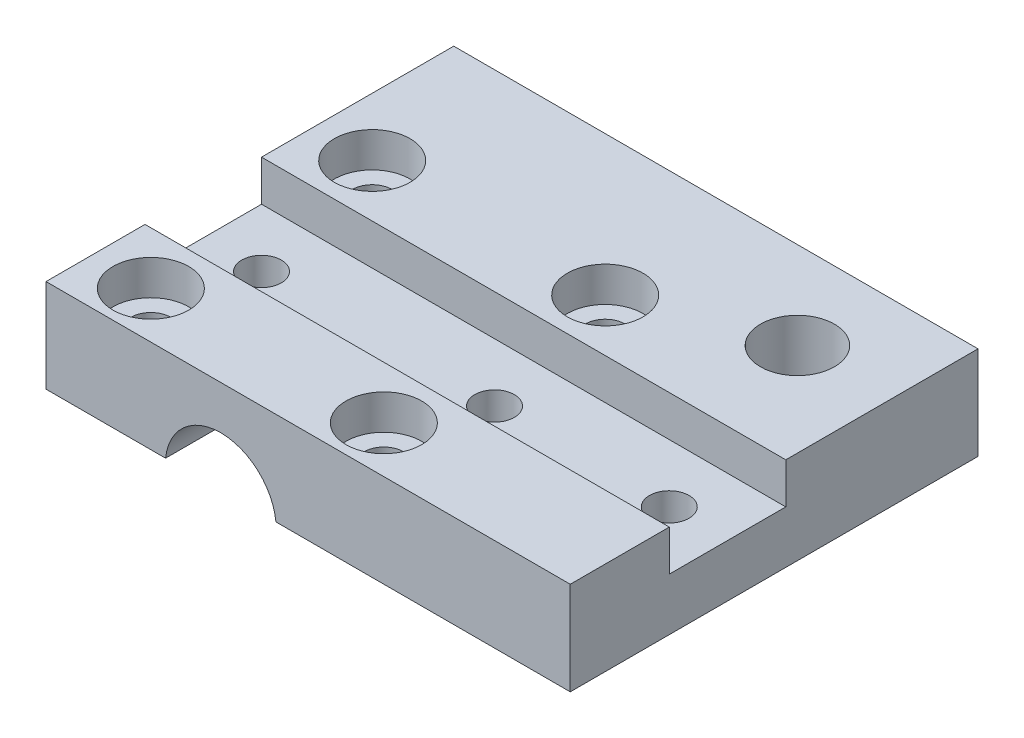
ISO-10303-21;
HEADER;
FILE_DESCRIPTION(('STEP AP214'),'2;1');
FILE_NAME('part.step','',(''),(''),'','','');
FILE_SCHEMA(('AUTOMOTIVE_DESIGN { 1 0 10303 214 1 1 1 1 }'));
ENDSEC;
DATA;
#1=APPLICATION_CONTEXT('core data for automotive mechanical design processes');
#2=APPLICATION_PROTOCOL_DEFINITION('international standard','automotive_design',2000,#1);
#3=PRODUCT_CONTEXT('',#1,'mechanical');
#4=PRODUCT('Part','Part','',(#3));
#5=PRODUCT_RELATED_PRODUCT_CATEGORY('part','',(#4));
#6=PRODUCT_DEFINITION_FORMATION('','',#4);
#7=PRODUCT_DEFINITION_CONTEXT('part definition',#1,'design');
#8=PRODUCT_DEFINITION('design','',#6,#7);
#9=PRODUCT_DEFINITION_SHAPE('','',#8);
#10=(LENGTH_UNIT() NAMED_UNIT(*) SI_UNIT(.MILLI.,.METRE.));
#11=(NAMED_UNIT(*) PLANE_ANGLE_UNIT() SI_UNIT($,.RADIAN.));
#12=(NAMED_UNIT(*) SI_UNIT($,.STERADIAN.) SOLID_ANGLE_UNIT());
#13=UNCERTAINTY_MEASURE_WITH_UNIT(LENGTH_MEASURE(1.E-05),#10,'distance_accuracy_value','');
#14=(GEOMETRIC_REPRESENTATION_CONTEXT(3) GLOBAL_UNCERTAINTY_ASSIGNED_CONTEXT((#13)) GLOBAL_UNIT_ASSIGNED_CONTEXT((#10,
#11,#12)) REPRESENTATION_CONTEXT('',''));
#15=CARTESIAN_POINT('',(0.,0.,0.));
#16=DIRECTION('',(0.,0.,1.));
#17=DIRECTION('',(1.,0.,0.));
#18=AXIS2_PLACEMENT_3D('',#15,#16,#17);
#19=CARTESIAN_POINT('',(25.,5.,3.99999999999999));
#20=DIRECTION('',(0.,1.,0.));
#21=DIRECTION('',(0.,0.,1.));
#22=AXIS2_PLACEMENT_3D('',#19,#20,#21);
#23=CYLINDRICAL_SURFACE('',#22,1.69999999999999);
#24=CARTESIAN_POINT('',(25.,5.,3.99999999999999));
#25=DIRECTION('',(0.,1.,0.));
#26=DIRECTION('',(0.,0.,1.));
#27=AXIS2_PLACEMENT_3D('',#24,#25,#26);
#28=CIRCLE('',#27,1.69999999999999);
#29=CARTESIAN_POINT('',(25.,5.,5.69999999999998));
#30=VERTEX_POINT('',#29);
#31=EDGE_CURVE('E183',#30,#30,#28,.T.);
#32=ORIENTED_EDGE('',*,*,#31,.T.);
#33=EDGE_LOOP('',(#32));
#34=FACE_BOUND('',#33,.T.);
#35=CARTESIAN_POINT('',(25.,1.5,3.99999999999999));
#36=DIRECTION('',(0.,-1.,0.));
#37=DIRECTION('',(0.,0.,-1.));
#38=AXIS2_PLACEMENT_3D('',#35,#36,#37);
#39=CIRCLE('',#38,1.69999999999999);
#40=CARTESIAN_POINT('',(25.,1.5,2.3));
#41=VERTEX_POINT('',#40);
#42=EDGE_CURVE('E36',#41,#41,#39,.F.);
#43=ORIENTED_EDGE('',*,*,#42,.F.);
#44=EDGE_LOOP('',(#43));
#45=FACE_BOUND('',#44,.T.);
#46=ADVANCED_FACE('F32',(#34,#45),#23,.F.);
#47=CARTESIAN_POINT('',(10.,5.,4.));
#48=DIRECTION('',(0.,1.,0.));
#49=DIRECTION('',(0.,0.,1.));
#50=AXIS2_PLACEMENT_3D('',#47,#48,#49);
#51=CYLINDRICAL_SURFACE('',#50,1.69999999999999);
#52=CARTESIAN_POINT('',(10.,5.,4.));
#53=DIRECTION('',(0.,1.,0.));
#54=DIRECTION('',(0.,0.,1.));
#55=AXIS2_PLACEMENT_3D('',#52,#53,#54);
#56=CIRCLE('',#55,1.69999999999999);
#57=CARTESIAN_POINT('',(10.,5.,5.69999999999998));
#58=VERTEX_POINT('',#57);
#59=EDGE_CURVE('E158',#58,#58,#56,.T.);
#60=ORIENTED_EDGE('',*,*,#59,.T.);
#61=EDGE_LOOP('',(#60));
#62=FACE_BOUND('',#61,.T.);
#63=CARTESIAN_POINT('',(10.,1.5,4.));
#64=DIRECTION('',(0.,-1.,0.));
#65=DIRECTION('',(0.,0.,-1.));
#66=AXIS2_PLACEMENT_3D('',#63,#64,#65);
#67=CIRCLE('',#66,1.69999999999999);
#68=CARTESIAN_POINT('',(10.,1.5,2.3));
#69=VERTEX_POINT('',#68);
#70=EDGE_CURVE('E160',#69,#69,#67,.F.);
#71=ORIENTED_EDGE('',*,*,#70,.F.);
#72=EDGE_LOOP('',(#71));
#73=FACE_BOUND('',#72,.T.);
#74=ADVANCED_FACE('F319',(#62,#73),#51,.F.);
#75=CARTESIAN_POINT('',(-10.,5.,3.99999999999999));
#76=DIRECTION('',(0.,1.,0.));
#77=DIRECTION('',(0.,0.,1.));
#78=AXIS2_PLACEMENT_3D('',#75,#76,#77);
#79=CYLINDRICAL_SURFACE('',#78,1.69999999999999);
#80=CARTESIAN_POINT('',(-10.,5.,3.99999999999999));
#81=DIRECTION('',(0.,1.,0.));
#82=DIRECTION('',(0.,0.,1.));
#83=AXIS2_PLACEMENT_3D('',#80,#81,#82);
#84=CIRCLE('',#83,1.69999999999999);
#85=CARTESIAN_POINT('',(-10.,5.,5.69999999999998));
#86=VERTEX_POINT('',#85);
#87=EDGE_CURVE('E186',#86,#86,#84,.T.);
#88=ORIENTED_EDGE('',*,*,#87,.T.);
#89=EDGE_LOOP('',(#88));
#90=FACE_BOUND('',#89,.T.);
#91=CARTESIAN_POINT('',(-10.,1.5,3.99999999999999));
#92=DIRECTION('',(0.,-1.,0.));
#93=DIRECTION('',(0.,0.,-1.));
#94=AXIS2_PLACEMENT_3D('',#91,#92,#93);
#95=CIRCLE('',#94,1.69999999999999);
#96=CARTESIAN_POINT('',(-10.,1.5,2.3));
#97=VERTEX_POINT('',#96);
#98=EDGE_CURVE('E156',#97,#97,#95,.F.);
#99=ORIENTED_EDGE('',*,*,#98,.F.);
#100=EDGE_LOOP('',(#99));
#101=FACE_BOUND('',#100,.T.);
#102=ADVANCED_FACE('F316',(#90,#101),#79,.F.);
#103=CARTESIAN_POINT('',(-15.,8.5,17.5));
#104=DIRECTION('',(0.,-1.,0.));
#105=DIRECTION('',(0.,0.,-1.));
#106=AXIS2_PLACEMENT_3D('',#103,#104,#105);
#107=PLANE('',#106);
#108=CARTESIAN_POINT('',(10.,8.5,-5.50000000000001));
#109=DIRECTION('',(0.,1.,0.));
#110=DIRECTION('',(0.,0.,1.));
#111=AXIS2_PLACEMENT_3D('',#108,#109,#110);
#112=CIRCLE('',#111,3.25);
#113=CARTESIAN_POINT('',(10.,8.5,-2.25000000000001));
#114=VERTEX_POINT('',#113);
#115=EDGE_CURVE('E201',#114,#114,#112,.T.);
#116=ORIENTED_EDGE('',*,*,#115,.F.);
#117=EDGE_LOOP('',(#116));
#118=FACE_BOUND('',#117,.T.);
#119=CARTESIAN_POINT('',(-10.,8.5,-5.5));
#120=DIRECTION('',(0.,1.,0.));
#121=DIRECTION('',(0.,0.,1.));
#122=AXIS2_PLACEMENT_3D('',#119,#120,#121);
#123=CIRCLE('',#122,3.25);
#124=CARTESIAN_POINT('',(-10.,8.5,-2.25000000000001));
#125=VERTEX_POINT('',#124);
#126=EDGE_CURVE('E213',#125,#125,#123,.T.);
#127=ORIENTED_EDGE('',*,*,#126,.F.);
#128=EDGE_LOOP('',(#127));
#129=FACE_BOUND('',#128,.T.);
#130=CARTESIAN_POINT('',(22.,8.5,-10.));
#131=DIRECTION('',(0.,1.,0.));
#132=DIRECTION('',(0.,0.,1.));
#133=AXIS2_PLACEMENT_3D('',#130,#131,#132);
#134=CIRCLE('',#133,3.175);
#135=CARTESIAN_POINT('',(22.,8.5,-6.825));
#136=VERTEX_POINT('',#135);
#137=EDGE_CURVE('E256',#136,#136,#134,.T.);
#138=ORIENTED_EDGE('',*,*,#137,.F.);
#139=EDGE_LOOP('',(#138));
#140=FACE_BOUND('',#139,.T.);
#141=DIRECTION('',(1.,0.,0.));
#142=VECTOR('',#141,1.);
#143=CARTESIAN_POINT('',(-15.,8.5,-1.00000000000001));
#144=LINE('',#143,#142);
#145=CARTESIAN_POINT('',(-15.,8.5,-1.00000000000001));
#146=VERTEX_POINT('',#145);
#147=CARTESIAN_POINT('',(30.,8.5,-1.));
#148=VERTEX_POINT('',#147);
#149=EDGE_CURVE('E242',#146,#148,#144,.T.);
#150=ORIENTED_EDGE('',*,*,#149,.T.);
#151=DIRECTION('',(0.,0.,-1.));
#152=VECTOR('',#151,1.);
#153=CARTESIAN_POINT('',(30.,8.5,17.5));
#154=LINE('',#153,#152);
#155=CARTESIAN_POINT('',(30.,8.5,-17.5));
#156=VERTEX_POINT('',#155);
#157=EDGE_CURVE('E151',#148,#156,#154,.T.);
#158=ORIENTED_EDGE('',*,*,#157,.T.);
#159=DIRECTION('',(-1.,0.,0.));
#160=VECTOR('',#159,1.);
#161=CARTESIAN_POINT('',(-15.,8.5,-17.5));
#162=LINE('',#161,#160);
#163=CARTESIAN_POINT('',(-15.,8.5,-17.5));
#164=VERTEX_POINT('',#163);
#165=EDGE_CURVE('E145',#156,#164,#162,.T.);
#166=ORIENTED_EDGE('',*,*,#165,.T.);
#167=DIRECTION('',(0.,0.,-1.));
#168=VECTOR('',#167,1.);
#169=CARTESIAN_POINT('',(-15.,8.5,17.5));
#170=LINE('',#169,#168);
#171=EDGE_CURVE('E86',#146,#164,#170,.T.);
#172=ORIENTED_EDGE('',*,*,#171,.F.);
#173=EDGE_LOOP('',(#150,#158,#166,#172));
#174=FACE_BOUND('',#173,.T.);
#175=ADVANCED_FACE('F279',(#118,#129,#140,#174),#107,.F.);
#176=CARTESIAN_POINT('',(-15.,0.5,17.5));
#177=DIRECTION('',(1.,0.,0.));
#178=DIRECTION('',(0.,0.,-1.));
#179=AXIS2_PLACEMENT_3D('',#176,#177,#178);
#180=PLANE('',#179);
#181=CARTESIAN_POINT('',(-15.,8.5,17.5));
#182=VERTEX_POINT('',#181);
#183=CARTESIAN_POINT('',(-15.,8.5,8.99999999999999));
#184=VERTEX_POINT('',#183);
#185=EDGE_CURVE('E148',#182,#184,#170,.T.);
#186=ORIENTED_EDGE('',*,*,#185,.T.);
#187=DIRECTION('',(0.,1.,0.));
#188=VECTOR('',#187,1.);
#189=CARTESIAN_POINT('',(-15.,5.,8.99999999999999));
#190=LINE('',#189,#188);
#191=CARTESIAN_POINT('',(-15.,5.,8.99999999999999));
#192=VERTEX_POINT('',#191);
#193=EDGE_CURVE('E253',#192,#184,#190,.T.);
#194=ORIENTED_EDGE('',*,*,#193,.F.);
#195=DIRECTION('',(0.,0.,-1.));
#196=VECTOR('',#195,1.);
#197=CARTESIAN_POINT('',(-15.,5.,8.99999999999999));
#198=LINE('',#197,#196);
#199=CARTESIAN_POINT('',(-15.,5.,-1.00000000000001));
#200=VERTEX_POINT('',#199);
#201=EDGE_CURVE('E246',#192,#200,#198,.T.);
#202=ORIENTED_EDGE('',*,*,#201,.T.);
#203=DIRECTION('',(0.,1.,0.));
#204=VECTOR('',#203,1.);
#205=CARTESIAN_POINT('',(-15.,5.,-1.00000000000001));
#206=LINE('',#205,#204);
#207=EDGE_CURVE('E257',#200,#146,#206,.T.);
#208=ORIENTED_EDGE('',*,*,#207,.T.);
#209=ORIENTED_EDGE('',*,*,#171,.T.);
#210=DIRECTION('',(0.,-1.,0.));
#211=VECTOR('',#210,1.);
#212=CARTESIAN_POINT('',(-15.,0.5,-17.5));
#213=LINE('',#212,#211);
#214=CARTESIAN_POINT('',(-15.,0.5,-17.5));
#215=VERTEX_POINT('',#214);
#216=EDGE_CURVE('E135',#164,#215,#213,.T.);
#217=ORIENTED_EDGE('',*,*,#216,.T.);
#218=DIRECTION('',(0.,0.,-1.));
#219=VECTOR('',#218,1.);
#220=CARTESIAN_POINT('',(-15.,0.5,17.5));
#221=LINE('',#220,#219);
#222=CARTESIAN_POINT('',(-15.,0.5,17.5));
#223=VERTEX_POINT('',#222);
#224=EDGE_CURVE('E11',#223,#215,#221,.T.);
#225=ORIENTED_EDGE('',*,*,#224,.F.);
#226=DIRECTION('',(0.,-1.,0.));
#227=VECTOR('',#226,1.);
#228=CARTESIAN_POINT('',(-15.,0.5,17.5));
#229=LINE('',#228,#227);
#230=EDGE_CURVE('E147',#182,#223,#229,.T.);
#231=ORIENTED_EDGE('',*,*,#230,.F.);
#232=EDGE_LOOP('',(#186,#194,#202,#208,#209,#217,#225,#231));
#233=FACE_BOUND('',#232,.T.);
#234=ADVANCED_FACE('F34',(#233),#180,.F.);
#235=CARTESIAN_POINT('',(-15.,0.5,17.5));
#236=DIRECTION('',(0.,1.,0.));
#237=DIRECTION('',(0.,0.,1.));
#238=AXIS2_PLACEMENT_3D('',#235,#236,#237);
#239=PLANE('',#238);
#240=CARTESIAN_POINT('',(-10.,0.5,3.99999999999999));
#241=DIRECTION('',(0.,-1.,0.));
#242=DIRECTION('',(0.,0.,-1.));
#243=AXIS2_PLACEMENT_3D('',#240,#241,#242);
#244=CIRCLE('',#243,4.);
#245=CARTESIAN_POINT('',(-10.,0.5,0.));
#246=VERTEX_POINT('',#245);
#247=EDGE_CURVE('E162',#246,#246,#244,.T.);
#248=ORIENTED_EDGE('',*,*,#247,.F.);
#249=EDGE_LOOP('',(#248));
#250=FACE_BOUND('',#249,.T.);
#251=CARTESIAN_POINT('',(-10.,0.5,-5.5));
#252=DIRECTION('',(0.,1.,0.));
#253=DIRECTION('',(0.,0.,1.));
#254=AXIS2_PLACEMENT_3D('',#251,#252,#253);
#255=CIRCLE('',#254,1.7);
#256=CARTESIAN_POINT('',(-10.,0.5,-3.8));
#257=VERTEX_POINT('',#256);
#258=EDGE_CURVE('E222',#257,#257,#255,.T.);
#259=ORIENTED_EDGE('',*,*,#258,.T.);
#260=EDGE_LOOP('',(#259));
#261=FACE_BOUND('',#260,.T.);
#262=CARTESIAN_POINT('',(-10.,0.5,13.5));
#263=DIRECTION('',(0.,1.,0.));
#264=DIRECTION('',(0.,0.,1.));
#265=AXIS2_PLACEMENT_3D('',#262,#263,#264);
#266=CIRCLE('',#265,1.7);
#267=CARTESIAN_POINT('',(-10.,0.5,15.2));
#268=VERTEX_POINT('',#267);
#269=EDGE_CURVE('E234',#268,#268,#266,.T.);
#270=ORIENTED_EDGE('',*,*,#269,.T.);
#271=EDGE_LOOP('',(#270));
#272=FACE_BOUND('',#271,.T.);
#273=DIRECTION('',(1.,0.,0.));
#274=VECTOR('',#273,1.);
#275=CARTESIAN_POINT('',(-15.,0.5,-17.5));
#276=LINE('',#275,#274);
#277=CARTESIAN_POINT('',(-4.73618055504644,0.5,-17.5));
#278=VERTEX_POINT('',#277);
#279=EDGE_CURVE('E137',#215,#278,#276,.T.);
#280=ORIENTED_EDGE('',*,*,#279,.T.);
#281=DIRECTION('',(0.,0.,-1.));
#282=VECTOR('',#281,1.);
#283=CARTESIAN_POINT('',(-4.73618055504644,0.5,17.5));
#284=LINE('',#283,#282);
#285=CARTESIAN_POINT('',(-4.73618055504644,0.5,17.5));
#286=VERTEX_POINT('',#285);
#287=EDGE_CURVE('E41',#286,#278,#284,.T.);
#288=ORIENTED_EDGE('',*,*,#287,.F.);
#289=DIRECTION('',(1.,0.,0.));
#290=VECTOR('',#289,1.);
#291=CARTESIAN_POINT('',(-15.,0.5,17.5));
#292=LINE('',#291,#290);
#293=EDGE_CURVE('E94',#223,#286,#292,.T.);
#294=ORIENTED_EDGE('',*,*,#293,.F.);
#295=ORIENTED_EDGE('',*,*,#224,.T.);
#296=EDGE_LOOP('',(#280,#288,#294,#295));
#297=FACE_BOUND('',#296,.T.);
#298=ADVANCED_FACE('F268',(#250,#261,#272,#297),#239,.F.);
#299=CARTESIAN_POINT('',(0.,0.,17.5));
#300=DIRECTION('',(0.,0.,-1.));
#301=DIRECTION('',(-1.,0.,0.));
#302=AXIS2_PLACEMENT_3D('',#299,#300,#301);
#303=CYLINDRICAL_SURFACE('',#302,4.7625);
#304=CARTESIAN_POINT('',(0.,0.,-17.5));
#305=DIRECTION('',(0.,0.,-1.));
#306=DIRECTION('',(1.,0.,0.));
#307=AXIS2_PLACEMENT_3D('',#304,#305,#306);
#308=CIRCLE('',#307,4.7625);
#309=CARTESIAN_POINT('',(4.73618055504644,0.5,-17.5));
#310=VERTEX_POINT('',#309);
#311=EDGE_CURVE('E140',#278,#310,#308,.T.);
#312=ORIENTED_EDGE('',*,*,#311,.T.);
#313=DIRECTION('',(0.,0.,-1.));
#314=VECTOR('',#313,1.);
#315=CARTESIAN_POINT('',(4.73618055504644,0.5,17.5));
#316=LINE('',#315,#314);
#317=CARTESIAN_POINT('',(4.73618055504644,0.5,17.5));
#318=VERTEX_POINT('',#317);
#319=EDGE_CURVE('E124',#318,#310,#316,.T.);
#320=ORIENTED_EDGE('',*,*,#319,.F.);
#321=CARTESIAN_POINT('',(0.,0.,17.5));
#322=DIRECTION('',(0.,0.,-1.));
#323=DIRECTION('',(1.,0.,0.));
#324=AXIS2_PLACEMENT_3D('',#321,#322,#323);
#325=CIRCLE('',#324,4.7625);
#326=EDGE_CURVE('E111',#286,#318,#325,.T.);
#327=ORIENTED_EDGE('',*,*,#326,.F.);
#328=ORIENTED_EDGE('',*,*,#287,.T.);
#329=EDGE_LOOP('',(#312,#320,#327,#328));
#330=FACE_BOUND('',#329,.T.);
#331=ADVANCED_FACE('F271',(#330),#303,.F.);
#332=CARTESIAN_POINT('',(4.73618055504644,0.5,17.5));
#333=DIRECTION('',(0.,1.,0.));
#334=DIRECTION('',(0.,0.,1.));
#335=AXIS2_PLACEMENT_3D('',#332,#333,#334);
#336=PLANE('',#335);
#337=CARTESIAN_POINT('',(25.,0.5,3.99999999999999));
#338=DIRECTION('',(0.,-1.,0.));
#339=DIRECTION('',(0.,0.,-1.));
#340=AXIS2_PLACEMENT_3D('',#337,#338,#339);
#341=CIRCLE('',#340,4.);
#342=CARTESIAN_POINT('',(25.,0.5,0.));
#343=VERTEX_POINT('',#342);
#344=EDGE_CURVE('E176',#343,#343,#341,.T.);
#345=ORIENTED_EDGE('',*,*,#344,.F.);
#346=EDGE_LOOP('',(#345));
#347=FACE_BOUND('',#346,.T.);
#348=CARTESIAN_POINT('',(10.,0.5,4.));
#349=DIRECTION('',(0.,-1.,0.));
#350=DIRECTION('',(0.,0.,-1.));
#351=AXIS2_PLACEMENT_3D('',#348,#349,#350);
#352=CIRCLE('',#351,4.);
#353=CARTESIAN_POINT('',(10.,0.5,0.));
#354=VERTEX_POINT('',#353);
#355=EDGE_CURVE('E169',#354,#354,#352,.T.);
#356=ORIENTED_EDGE('',*,*,#355,.F.);
#357=EDGE_LOOP('',(#356));
#358=FACE_BOUND('',#357,.T.);
#359=CARTESIAN_POINT('',(10.,0.5,13.5));
#360=DIRECTION('',(0.,1.,0.));
#361=DIRECTION('',(0.,0.,1.));
#362=AXIS2_PLACEMENT_3D('',#359,#360,#361);
#363=CIRCLE('',#362,1.7);
#364=CARTESIAN_POINT('',(10.,0.5,15.2));
#365=VERTEX_POINT('',#364);
#366=EDGE_CURVE('E198',#365,#365,#363,.T.);
#367=ORIENTED_EDGE('',*,*,#366,.T.);
#368=EDGE_LOOP('',(#367));
#369=FACE_BOUND('',#368,.T.);
#370=CARTESIAN_POINT('',(10.,0.5,-5.50000000000001));
#371=DIRECTION('',(0.,1.,0.));
#372=DIRECTION('',(0.,0.,1.));
#373=AXIS2_PLACEMENT_3D('',#370,#371,#372);
#374=CIRCLE('',#373,1.7);
#375=CARTESIAN_POINT('',(10.,0.5,-3.80000000000001));
#376=VERTEX_POINT('',#375);
#377=EDGE_CURVE('E210',#376,#376,#374,.T.);
#378=ORIENTED_EDGE('',*,*,#377,.T.);
#379=EDGE_LOOP('',(#378));
#380=FACE_BOUND('',#379,.T.);
#381=CARTESIAN_POINT('',(22.,0.5,-10.));
#382=DIRECTION('',(0.,1.,0.));
#383=DIRECTION('',(0.,0.,1.));
#384=AXIS2_PLACEMENT_3D('',#381,#382,#383);
#385=CIRCLE('',#384,3.175);
#386=CARTESIAN_POINT('',(22.,0.5,-6.825));
#387=VERTEX_POINT('',#386);
#388=EDGE_CURVE('E138',#387,#387,#385,.F.);
#389=ORIENTED_EDGE('',*,*,#388,.F.);
#390=EDGE_LOOP('',(#389));
#391=FACE_BOUND('',#390,.T.);
#392=DIRECTION('',(1.,0.,0.));
#393=VECTOR('',#392,1.);
#394=CARTESIAN_POINT('',(4.73618055504644,0.5,-17.5));
#395=LINE('',#394,#393);
#396=CARTESIAN_POINT('',(30.,0.5,-17.5));
#397=VERTEX_POINT('',#396);
#398=EDGE_CURVE('E121',#310,#397,#395,.T.);
#399=ORIENTED_EDGE('',*,*,#398,.T.);
#400=DIRECTION('',(0.,0.,-1.));
#401=VECTOR('',#400,1.);
#402=CARTESIAN_POINT('',(30.,0.5,17.5));
#403=LINE('',#402,#401);
#404=CARTESIAN_POINT('',(30.,0.5,17.5));
#405=VERTEX_POINT('',#404);
#406=EDGE_CURVE('E118',#405,#397,#403,.T.);
#407=ORIENTED_EDGE('',*,*,#406,.F.);
#408=DIRECTION('',(1.,0.,0.));
#409=VECTOR('',#408,1.);
#410=CARTESIAN_POINT('',(4.73618055504644,0.5,17.5));
#411=LINE('',#410,#409);
#412=EDGE_CURVE('E104',#318,#405,#411,.T.);
#413=ORIENTED_EDGE('',*,*,#412,.F.);
#414=ORIENTED_EDGE('',*,*,#319,.T.);
#415=EDGE_LOOP('',(#399,#407,#413,#414));
#416=FACE_BOUND('',#415,.T.);
#417=ADVANCED_FACE('F119',(#347,#358,#369,#380,#391,#416),#336,.F.);
#418=CARTESIAN_POINT('',(30.,5.5,17.5));
#419=DIRECTION('',(-1.,0.,0.));
#420=DIRECTION('',(0.,0.,1.));
#421=AXIS2_PLACEMENT_3D('',#418,#419,#420);
#422=PLANE('',#421);
#423=DIRECTION('',(0.,0.,1.));
#424=VECTOR('',#423,1.);
#425=CARTESIAN_POINT('',(30.,5.,-1.00000000000001));
#426=LINE('',#425,#424);
#427=CARTESIAN_POINT('',(30.,5.,-1.00000000000001));
#428=VERTEX_POINT('',#427);
#429=CARTESIAN_POINT('',(30.,5.,8.99999999999999));
#430=VERTEX_POINT('',#429);
#431=EDGE_CURVE('E241',#428,#430,#426,.T.);
#432=ORIENTED_EDGE('',*,*,#431,.T.);
#433=DIRECTION('',(0.,1.,0.));
#434=VECTOR('',#433,1.);
#435=CARTESIAN_POINT('',(30.,5.,8.99999999999999));
#436=LINE('',#435,#434);
#437=CARTESIAN_POINT('',(30.,8.5,8.99999999999999));
#438=VERTEX_POINT('',#437);
#439=EDGE_CURVE('E249',#430,#438,#436,.T.);
#440=ORIENTED_EDGE('',*,*,#439,.T.);
#441=CARTESIAN_POINT('',(30.,8.5,17.5));
#442=VERTEX_POINT('',#441);
#443=EDGE_CURVE('E125',#442,#438,#154,.T.);
#444=ORIENTED_EDGE('',*,*,#443,.F.);
#445=DIRECTION('',(0.,1.,0.));
#446=VECTOR('',#445,1.);
#447=CARTESIAN_POINT('',(30.,0.5,17.5));
#448=LINE('',#447,#446);
#449=EDGE_CURVE('E108',#405,#442,#448,.T.);
#450=ORIENTED_EDGE('',*,*,#449,.F.);
#451=ORIENTED_EDGE('',*,*,#406,.T.);
#452=DIRECTION('',(0.,1.,0.));
#453=VECTOR('',#452,1.);
#454=CARTESIAN_POINT('',(30.,5.5,-17.5));
#455=LINE('',#454,#453);
#456=EDGE_CURVE('E143',#397,#156,#455,.T.);
#457=ORIENTED_EDGE('',*,*,#456,.T.);
#458=ORIENTED_EDGE('',*,*,#157,.F.);
#459=DIRECTION('',(0.,1.,0.));
#460=VECTOR('',#459,1.);
#461=CARTESIAN_POINT('',(30.,5.,-1.00000000000001));
#462=LINE('',#461,#460);
#463=EDGE_CURVE('E49',#428,#148,#462,.T.);
#464=ORIENTED_EDGE('',*,*,#463,.F.);
#465=EDGE_LOOP('',(#432,#440,#444,#450,#451,#457,#458,#464));
#466=FACE_BOUND('',#465,.T.);
#467=ADVANCED_FACE('F128',(#466),#422,.F.);
#468=CARTESIAN_POINT('',(10.,8.5,13.5));
#469=DIRECTION('',(0.,1.,0.));
#470=DIRECTION('',(0.,0.,1.));
#471=AXIS2_PLACEMENT_3D('',#468,#469,#470);
#472=CIRCLE('',#471,3.25);
#473=CARTESIAN_POINT('',(10.,8.5,16.75));
#474=VERTEX_POINT('',#473);
#475=EDGE_CURVE('E189',#474,#474,#472,.T.);
#476=ORIENTED_EDGE('',*,*,#475,.F.);
#477=EDGE_LOOP('',(#476));
#478=FACE_BOUND('',#477,.T.);
#479=CARTESIAN_POINT('',(-10.,8.5,13.5));
#480=DIRECTION('',(0.,1.,0.));
#481=DIRECTION('',(0.,0.,1.));
#482=AXIS2_PLACEMENT_3D('',#479,#480,#481);
#483=CIRCLE('',#482,3.25);
#484=CARTESIAN_POINT('',(-10.,8.5,16.75));
#485=VERTEX_POINT('',#484);
#486=EDGE_CURVE('E225',#485,#485,#483,.T.);
#487=ORIENTED_EDGE('',*,*,#486,.F.);
#488=EDGE_LOOP('',(#487));
#489=FACE_BOUND('',#488,.T.);
#490=ORIENTED_EDGE('',*,*,#443,.T.);
#491=DIRECTION('',(1.,0.,0.));
#492=VECTOR('',#491,1.);
#493=CARTESIAN_POINT('',(-15.,8.5,8.99999999999999));
#494=LINE('',#493,#492);
#495=EDGE_CURVE('E237',#184,#438,#494,.T.);
#496=ORIENTED_EDGE('',*,*,#495,.F.);
#497=ORIENTED_EDGE('',*,*,#185,.F.);
#498=DIRECTION('',(-1.,0.,0.));
#499=VECTOR('',#498,1.);
#500=CARTESIAN_POINT('',(-15.,8.5,17.5));
#501=LINE('',#500,#499);
#502=EDGE_CURVE('E58',#442,#182,#501,.T.);
#503=ORIENTED_EDGE('',*,*,#502,.F.);
#504=EDGE_LOOP('',(#490,#496,#497,#503));
#505=FACE_BOUND('',#504,.T.);
#506=ADVANCED_FACE('F302',(#478,#489,#505),#107,.F.);
#507=CARTESIAN_POINT('',(0.,0.,17.5));
#508=DIRECTION('',(0.,0.,1.));
#509=DIRECTION('',(1.,0.,0.));
#510=AXIS2_PLACEMENT_3D('',#507,#508,#509);
#511=PLANE('',#510);
#512=ORIENTED_EDGE('',*,*,#230,.T.);
#513=ORIENTED_EDGE('',*,*,#293,.T.);
#514=ORIENTED_EDGE('',*,*,#326,.T.);
#515=ORIENTED_EDGE('',*,*,#412,.T.);
#516=ORIENTED_EDGE('',*,*,#449,.T.);
#517=ORIENTED_EDGE('',*,*,#502,.T.);
#518=EDGE_LOOP('',(#512,#513,#514,#515,#516,#517));
#519=FACE_BOUND('',#518,.T.);
#520=ADVANCED_FACE('F106',(#519),#511,.T.);
#521=CARTESIAN_POINT('',(0.,0.,-17.5));
#522=DIRECTION('',(0.,0.,1.));
#523=DIRECTION('',(1.,0.,0.));
#524=AXIS2_PLACEMENT_3D('',#521,#522,#523);
#525=PLANE('',#524);
#526=ORIENTED_EDGE('',*,*,#216,.F.);
#527=ORIENTED_EDGE('',*,*,#165,.F.);
#528=ORIENTED_EDGE('',*,*,#456,.F.);
#529=ORIENTED_EDGE('',*,*,#398,.F.);
#530=ORIENTED_EDGE('',*,*,#311,.F.);
#531=ORIENTED_EDGE('',*,*,#279,.F.);
#532=EDGE_LOOP('',(#526,#527,#528,#529,#530,#531));
#533=FACE_BOUND('',#532,.T.);
#534=ADVANCED_FACE('F274',(#533),#525,.F.);
#535=CARTESIAN_POINT('',(22.,0.498999999999999,-10.));
#536=DIRECTION('',(0.,1.,0.));
#537=DIRECTION('',(0.,0.,1.));
#538=AXIS2_PLACEMENT_3D('',#535,#536,#537);
#539=CYLINDRICAL_SURFACE('',#538,3.175);
#540=ORIENTED_EDGE('',*,*,#137,.T.);
#541=EDGE_LOOP('',(#540));
#542=FACE_BOUND('',#541,.T.);
#543=ORIENTED_EDGE('',*,*,#388,.T.);
#544=EDGE_LOOP('',(#543));
#545=FACE_BOUND('',#544,.T.);
#546=ADVANCED_FACE('F390',(#542,#545),#539,.F.);
#547=CARTESIAN_POINT('',(-15.,5.,8.99999999999999));
#548=DIRECTION('',(0.,0.,1.));
#549=DIRECTION('',(1.,0.,0.));
#550=AXIS2_PLACEMENT_3D('',#547,#548,#549);
#551=PLANE('',#550);
#552=ORIENTED_EDGE('',*,*,#495,.T.);
#553=ORIENTED_EDGE('',*,*,#439,.F.);
#554=DIRECTION('',(1.,0.,0.));
#555=VECTOR('',#554,1.);
#556=CARTESIAN_POINT('',(-15.,5.,8.99999999999999));
#557=LINE('',#556,#555);
#558=EDGE_CURVE('E238',#192,#430,#557,.T.);
#559=ORIENTED_EDGE('',*,*,#558,.F.);
#560=ORIENTED_EDGE('',*,*,#193,.T.);
#561=EDGE_LOOP('',(#552,#553,#559,#560));
#562=FACE_BOUND('',#561,.T.);
#563=ADVANCED_FACE('F297',(#562),#551,.F.);
#564=CARTESIAN_POINT('',(-15.,5.,-1.00000000000001));
#565=DIRECTION('',(0.,0.,1.));
#566=DIRECTION('',(1.,0.,0.));
#567=AXIS2_PLACEMENT_3D('',#564,#565,#566);
#568=PLANE('',#567);
#569=ORIENTED_EDGE('',*,*,#149,.F.);
#570=ORIENTED_EDGE('',*,*,#207,.F.);
#571=DIRECTION('',(1.,0.,0.));
#572=VECTOR('',#571,1.);
#573=CARTESIAN_POINT('',(-15.,5.,-1.00000000000001));
#574=LINE('',#573,#572);
#575=EDGE_CURVE('E244',#200,#428,#574,.T.);
#576=ORIENTED_EDGE('',*,*,#575,.T.);
#577=ORIENTED_EDGE('',*,*,#463,.T.);
#578=EDGE_LOOP('',(#569,#570,#576,#577));
#579=FACE_BOUND('',#578,.T.);
#580=ADVANCED_FACE('F282',(#579),#568,.T.);
#581=CARTESIAN_POINT('',(30.,5.,8.99999999999999));
#582=DIRECTION('',(0.,-1.,0.));
#583=DIRECTION('',(0.,0.,-1.));
#584=AXIS2_PLACEMENT_3D('',#581,#582,#583);
#585=PLANE('',#584);
#586=ORIENTED_EDGE('',*,*,#59,.F.);
#587=EDGE_LOOP('',(#586));
#588=FACE_BOUND('',#587,.T.);
#589=ORIENTED_EDGE('',*,*,#31,.F.);
#590=EDGE_LOOP('',(#589));
#591=FACE_BOUND('',#590,.T.);
#592=ORIENTED_EDGE('',*,*,#87,.F.);
#593=EDGE_LOOP('',(#592));
#594=FACE_BOUND('',#593,.T.);
#595=ORIENTED_EDGE('',*,*,#558,.T.);
#596=ORIENTED_EDGE('',*,*,#431,.F.);
#597=ORIENTED_EDGE('',*,*,#575,.F.);
#598=ORIENTED_EDGE('',*,*,#201,.F.);
#599=EDGE_LOOP('',(#595,#596,#597,#598));
#600=FACE_BOUND('',#599,.T.);
#601=ADVANCED_FACE('F291',(#588,#591,#594,#600),#585,.F.);
#602=CARTESIAN_POINT('',(-10.,8.5,13.5));
#603=DIRECTION('',(0.,1.,0.));
#604=DIRECTION('',(0.,0.,1.));
#605=AXIS2_PLACEMENT_3D('',#602,#603,#604);
#606=CYLINDRICAL_SURFACE('',#605,1.7);
#607=ORIENTED_EDGE('',*,*,#269,.F.);
#608=EDGE_LOOP('',(#607));
#609=FACE_BOUND('',#608,.T.);
#610=CARTESIAN_POINT('',(-10.,5.5,13.5));
#611=DIRECTION('',(0.,1.,0.));
#612=DIRECTION('',(0.,0.,1.));
#613=AXIS2_PLACEMENT_3D('',#610,#611,#612);
#614=CIRCLE('',#613,1.7);
#615=CARTESIAN_POINT('',(-10.,5.5,15.2));
#616=VERTEX_POINT('',#615);
#617=EDGE_CURVE('E231',#616,#616,#614,.T.);
#618=ORIENTED_EDGE('',*,*,#617,.T.);
#619=EDGE_LOOP('',(#618));
#620=FACE_BOUND('',#619,.T.);
#621=ADVANCED_FACE('F378',(#609,#620),#606,.F.);
#622=CARTESIAN_POINT('',(-8.3,5.5,13.5));
#623=DIRECTION('',(0.,-1.,0.));
#624=DIRECTION('',(0.,0.,-1.));
#625=AXIS2_PLACEMENT_3D('',#622,#623,#624);
#626=PLANE('',#625);
#627=ORIENTED_EDGE('',*,*,#617,.F.);
#628=EDGE_LOOP('',(#627));
#629=FACE_BOUND('',#628,.T.);
#630=CARTESIAN_POINT('',(-10.,5.5,13.5));
#631=DIRECTION('',(0.,1.,0.));
#632=DIRECTION('',(0.,0.,1.));
#633=AXIS2_PLACEMENT_3D('',#630,#631,#632);
#634=CIRCLE('',#633,3.25);
#635=CARTESIAN_POINT('',(-10.,5.5,16.75));
#636=VERTEX_POINT('',#635);
#637=EDGE_CURVE('E228',#636,#636,#634,.T.);
#638=ORIENTED_EDGE('',*,*,#637,.T.);
#639=EDGE_LOOP('',(#638));
#640=FACE_BOUND('',#639,.T.);
#641=ADVANCED_FACE('F374',(#629,#640),#626,.F.);
#642=CARTESIAN_POINT('',(-10.,8.5,13.5));
#643=DIRECTION('',(0.,1.,0.));
#644=DIRECTION('',(0.,0.,1.));
#645=AXIS2_PLACEMENT_3D('',#642,#643,#644);
#646=CYLINDRICAL_SURFACE('',#645,3.25);
#647=ORIENTED_EDGE('',*,*,#637,.F.);
#648=EDGE_LOOP('',(#647));
#649=FACE_BOUND('',#648,.T.);
#650=ORIENTED_EDGE('',*,*,#486,.T.);
#651=EDGE_LOOP('',(#650));
#652=FACE_BOUND('',#651,.T.);
#653=ADVANCED_FACE('F370',(#649,#652),#646,.F.);
#654=CARTESIAN_POINT('',(-10.,8.5,-5.5));
#655=DIRECTION('',(0.,1.,0.));
#656=DIRECTION('',(0.,0.,1.));
#657=AXIS2_PLACEMENT_3D('',#654,#655,#656);
#658=CYLINDRICAL_SURFACE('',#657,1.7);
#659=ORIENTED_EDGE('',*,*,#258,.F.);
#660=EDGE_LOOP('',(#659));
#661=FACE_BOUND('',#660,.T.);
#662=CARTESIAN_POINT('',(-10.,5.5,-5.5));
#663=DIRECTION('',(0.,1.,0.));
#664=DIRECTION('',(0.,0.,1.));
#665=AXIS2_PLACEMENT_3D('',#662,#663,#664);
#666=CIRCLE('',#665,1.7);
#667=CARTESIAN_POINT('',(-10.,5.5,-3.8));
#668=VERTEX_POINT('',#667);
#669=EDGE_CURVE('E219',#668,#668,#666,.T.);
#670=ORIENTED_EDGE('',*,*,#669,.T.);
#671=EDGE_LOOP('',(#670));
#672=FACE_BOUND('',#671,.T.);
#673=ADVANCED_FACE('F366',(#661,#672),#658,.F.);
#674=CARTESIAN_POINT('',(-8.3,5.5,-5.5));
#675=DIRECTION('',(0.,-1.,0.));
#676=DIRECTION('',(0.,0.,-1.));
#677=AXIS2_PLACEMENT_3D('',#674,#675,#676);
#678=PLANE('',#677);
#679=ORIENTED_EDGE('',*,*,#669,.F.);
#680=EDGE_LOOP('',(#679));
#681=FACE_BOUND('',#680,.T.);
#682=CARTESIAN_POINT('',(-10.,5.5,-5.5));
#683=DIRECTION('',(0.,1.,0.));
#684=DIRECTION('',(0.,0.,1.));
#685=AXIS2_PLACEMENT_3D('',#682,#683,#684);
#686=CIRCLE('',#685,3.25);
#687=CARTESIAN_POINT('',(-10.,5.5,-2.25000000000001));
#688=VERTEX_POINT('',#687);
#689=EDGE_CURVE('E216',#688,#688,#686,.T.);
#690=ORIENTED_EDGE('',*,*,#689,.T.);
#691=EDGE_LOOP('',(#690));
#692=FACE_BOUND('',#691,.T.);
#693=ADVANCED_FACE('F362',(#681,#692),#678,.F.);
#694=CARTESIAN_POINT('',(-10.,8.5,-5.5));
#695=DIRECTION('',(0.,1.,0.));
#696=DIRECTION('',(0.,0.,1.));
#697=AXIS2_PLACEMENT_3D('',#694,#695,#696);
#698=CYLINDRICAL_SURFACE('',#697,3.25);
#699=ORIENTED_EDGE('',*,*,#689,.F.);
#700=EDGE_LOOP('',(#699));
#701=FACE_BOUND('',#700,.T.);
#702=ORIENTED_EDGE('',*,*,#126,.T.);
#703=EDGE_LOOP('',(#702));
#704=FACE_BOUND('',#703,.T.);
#705=ADVANCED_FACE('F358',(#701,#704),#698,.F.);
#706=CARTESIAN_POINT('',(10.,8.5,-5.50000000000001));
#707=DIRECTION('',(0.,1.,0.));
#708=DIRECTION('',(0.,0.,1.));
#709=AXIS2_PLACEMENT_3D('',#706,#707,#708);
#710=CYLINDRICAL_SURFACE('',#709,1.7);
#711=ORIENTED_EDGE('',*,*,#377,.F.);
#712=EDGE_LOOP('',(#711));
#713=FACE_BOUND('',#712,.T.);
#714=CARTESIAN_POINT('',(10.,5.5,-5.50000000000001));
#715=DIRECTION('',(0.,1.,0.));
#716=DIRECTION('',(0.,0.,1.));
#717=AXIS2_PLACEMENT_3D('',#714,#715,#716);
#718=CIRCLE('',#717,1.7);
#719=CARTESIAN_POINT('',(10.,5.5,-3.8));
#720=VERTEX_POINT('',#719);
#721=EDGE_CURVE('E207',#720,#720,#718,.T.);
#722=ORIENTED_EDGE('',*,*,#721,.T.);
#723=EDGE_LOOP('',(#722));
#724=FACE_BOUND('',#723,.T.);
#725=ADVANCED_FACE('F354',(#713,#724),#710,.F.);
#726=CARTESIAN_POINT('',(11.7,5.5,-5.50000000000001));
#727=DIRECTION('',(0.,-1.,0.));
#728=DIRECTION('',(0.,0.,-1.));
#729=AXIS2_PLACEMENT_3D('',#726,#727,#728);
#730=PLANE('',#729);
#731=ORIENTED_EDGE('',*,*,#721,.F.);
#732=EDGE_LOOP('',(#731));
#733=FACE_BOUND('',#732,.T.);
#734=CARTESIAN_POINT('',(10.,5.5,-5.50000000000001));
#735=DIRECTION('',(0.,1.,0.));
#736=DIRECTION('',(0.,0.,1.));
#737=AXIS2_PLACEMENT_3D('',#734,#735,#736);
#738=CIRCLE('',#737,3.25);
#739=CARTESIAN_POINT('',(10.,5.5,-2.25000000000001));
#740=VERTEX_POINT('',#739);
#741=EDGE_CURVE('E204',#740,#740,#738,.T.);
#742=ORIENTED_EDGE('',*,*,#741,.T.);
#743=EDGE_LOOP('',(#742));
#744=FACE_BOUND('',#743,.T.);
#745=ADVANCED_FACE('F350',(#733,#744),#730,.F.);
#746=CARTESIAN_POINT('',(10.,8.5,-5.50000000000001));
#747=DIRECTION('',(0.,1.,0.));
#748=DIRECTION('',(0.,0.,1.));
#749=AXIS2_PLACEMENT_3D('',#746,#747,#748);
#750=CYLINDRICAL_SURFACE('',#749,3.25);
#751=ORIENTED_EDGE('',*,*,#741,.F.);
#752=EDGE_LOOP('',(#751));
#753=FACE_BOUND('',#752,.T.);
#754=ORIENTED_EDGE('',*,*,#115,.T.);
#755=EDGE_LOOP('',(#754));
#756=FACE_BOUND('',#755,.T.);
#757=ADVANCED_FACE('F346',(#753,#756),#750,.F.);
#758=CARTESIAN_POINT('',(10.,8.5,13.5));
#759=DIRECTION('',(0.,1.,0.));
#760=DIRECTION('',(0.,0.,1.));
#761=AXIS2_PLACEMENT_3D('',#758,#759,#760);
#762=CYLINDRICAL_SURFACE('',#761,1.7);
#763=ORIENTED_EDGE('',*,*,#366,.F.);
#764=EDGE_LOOP('',(#763));
#765=FACE_BOUND('',#764,.T.);
#766=CARTESIAN_POINT('',(10.,5.5,13.5));
#767=DIRECTION('',(0.,1.,0.));
#768=DIRECTION('',(0.,0.,1.));
#769=AXIS2_PLACEMENT_3D('',#766,#767,#768);
#770=CIRCLE('',#769,1.7);
#771=CARTESIAN_POINT('',(10.,5.5,15.2));
#772=VERTEX_POINT('',#771);
#773=EDGE_CURVE('E195',#772,#772,#770,.T.);
#774=ORIENTED_EDGE('',*,*,#773,.T.);
#775=EDGE_LOOP('',(#774));
#776=FACE_BOUND('',#775,.T.);
#777=ADVANCED_FACE('F342',(#765,#776),#762,.F.);
#778=CARTESIAN_POINT('',(11.7,5.5,13.5));
#779=DIRECTION('',(0.,-1.,0.));
#780=DIRECTION('',(0.,0.,-1.));
#781=AXIS2_PLACEMENT_3D('',#778,#779,#780);
#782=PLANE('',#781);
#783=ORIENTED_EDGE('',*,*,#773,.F.);
#784=EDGE_LOOP('',(#783));
#785=FACE_BOUND('',#784,.T.);
#786=CARTESIAN_POINT('',(10.,5.5,13.5));
#787=DIRECTION('',(0.,1.,0.));
#788=DIRECTION('',(0.,0.,1.));
#789=AXIS2_PLACEMENT_3D('',#786,#787,#788);
#790=CIRCLE('',#789,3.25);
#791=CARTESIAN_POINT('',(10.,5.5,16.75));
#792=VERTEX_POINT('',#791);
#793=EDGE_CURVE('E192',#792,#792,#790,.T.);
#794=ORIENTED_EDGE('',*,*,#793,.T.);
#795=EDGE_LOOP('',(#794));
#796=FACE_BOUND('',#795,.T.);
#797=ADVANCED_FACE('F338',(#785,#796),#782,.F.);
#798=CARTESIAN_POINT('',(10.,8.5,13.5));
#799=DIRECTION('',(0.,1.,0.));
#800=DIRECTION('',(0.,0.,1.));
#801=AXIS2_PLACEMENT_3D('',#798,#799,#800);
#802=CYLINDRICAL_SURFACE('',#801,3.25);
#803=ORIENTED_EDGE('',*,*,#793,.F.);
#804=EDGE_LOOP('',(#803));
#805=FACE_BOUND('',#804,.T.);
#806=ORIENTED_EDGE('',*,*,#475,.T.);
#807=EDGE_LOOP('',(#806));
#808=FACE_BOUND('',#807,.T.);
#809=ADVANCED_FACE('F334',(#805,#808),#802,.F.);
#810=CARTESIAN_POINT('',(-10.,1.5,3.99999999999999));
#811=DIRECTION('',(0.,-1.,0.));
#812=DIRECTION('',(0.,0.,-1.));
#813=AXIS2_PLACEMENT_3D('',#810,#811,#812);
#814=PLANE('',#813);
#815=CARTESIAN_POINT('',(-10.,1.5,3.99999999999999));
#816=DIRECTION('',(0.,-1.,0.));
#817=DIRECTION('',(0.,0.,-1.));
#818=AXIS2_PLACEMENT_3D('',#815,#816,#817);
#819=CIRCLE('',#818,4.);
#820=CARTESIAN_POINT('',(-10.,1.5,0.));
#821=VERTEX_POINT('',#820);
#822=EDGE_CURVE('E159',#821,#821,#819,.T.);
#823=ORIENTED_EDGE('',*,*,#822,.T.);
#824=EDGE_LOOP('',(#823));
#825=FACE_BOUND('',#824,.T.);
#826=ORIENTED_EDGE('',*,*,#98,.T.);
#827=EDGE_LOOP('',(#826));
#828=FACE_BOUND('',#827,.T.);
#829=ADVANCED_FACE('F337',(#825,#828),#814,.T.);
#830=CARTESIAN_POINT('',(-10.,1.5,3.99999999999999));
#831=DIRECTION('',(0.,-1.,0.));
#832=DIRECTION('',(0.,0.,-1.));
#833=AXIS2_PLACEMENT_3D('',#830,#831,#832);
#834=CYLINDRICAL_SURFACE('',#833,4.);
#835=ORIENTED_EDGE('',*,*,#822,.F.);
#836=EDGE_LOOP('',(#835));
#837=FACE_BOUND('',#836,.T.);
#838=ORIENTED_EDGE('',*,*,#247,.T.);
#839=EDGE_LOOP('',(#838));
#840=FACE_BOUND('',#839,.T.);
#841=ADVANCED_FACE('F485',(#837,#840),#834,.F.);
#842=CARTESIAN_POINT('',(10.,1.5,4.));
#843=DIRECTION('',(0.,-1.,0.));
#844=DIRECTION('',(0.,0.,-1.));
#845=AXIS2_PLACEMENT_3D('',#842,#843,#844);
#846=PLANE('',#845);
#847=CARTESIAN_POINT('',(10.,1.5,4.));
#848=DIRECTION('',(0.,-1.,0.));
#849=DIRECTION('',(0.,0.,-1.));
#850=AXIS2_PLACEMENT_3D('',#847,#848,#849);
#851=CIRCLE('',#850,4.);
#852=CARTESIAN_POINT('',(10.,1.5,0.));
#853=VERTEX_POINT('',#852);
#854=EDGE_CURVE('E163',#853,#853,#851,.T.);
#855=ORIENTED_EDGE('',*,*,#854,.T.);
#856=EDGE_LOOP('',(#855));
#857=FACE_BOUND('',#856,.T.);
#858=ORIENTED_EDGE('',*,*,#70,.T.);
#859=EDGE_LOOP('',(#858));
#860=FACE_BOUND('',#859,.T.);
#861=ADVANCED_FACE('F493',(#857,#860),#846,.T.);
#862=CARTESIAN_POINT('',(10.,1.5,4.));
#863=DIRECTION('',(0.,-1.,0.));
#864=DIRECTION('',(0.,0.,-1.));
#865=AXIS2_PLACEMENT_3D('',#862,#863,#864);
#866=CYLINDRICAL_SURFACE('',#865,4.);
#867=ORIENTED_EDGE('',*,*,#854,.F.);
#868=EDGE_LOOP('',(#867));
#869=FACE_BOUND('',#868,.T.);
#870=ORIENTED_EDGE('',*,*,#355,.T.);
#871=EDGE_LOOP('',(#870));
#872=FACE_BOUND('',#871,.T.);
#873=ADVANCED_FACE('F500',(#869,#872),#866,.F.);
#874=CARTESIAN_POINT('',(25.,1.5,3.99999999999999));
#875=DIRECTION('',(0.,-1.,0.));
#876=DIRECTION('',(0.,0.,-1.));
#877=AXIS2_PLACEMENT_3D('',#874,#875,#876);
#878=PLANE('',#877);
#879=CARTESIAN_POINT('',(25.,1.5,3.99999999999999));
#880=DIRECTION('',(0.,-1.,0.));
#881=DIRECTION('',(0.,0.,-1.));
#882=AXIS2_PLACEMENT_3D('',#879,#880,#881);
#883=CIRCLE('',#882,4.);
#884=CARTESIAN_POINT('',(25.,1.5,0.));
#885=VERTEX_POINT('',#884);
#886=EDGE_CURVE('E541',#885,#885,#883,.T.);
#887=ORIENTED_EDGE('',*,*,#886,.T.);
#888=EDGE_LOOP('',(#887));
#889=FACE_BOUND('',#888,.T.);
#890=ORIENTED_EDGE('',*,*,#42,.T.);
#891=EDGE_LOOP('',(#890));
#892=FACE_BOUND('',#891,.T.);
#893=ADVANCED_FACE('F507',(#889,#892),#878,.T.);
#894=CARTESIAN_POINT('',(25.,1.5,3.99999999999999));
#895=DIRECTION('',(0.,-1.,0.));
#896=DIRECTION('',(0.,0.,-1.));
#897=AXIS2_PLACEMENT_3D('',#894,#895,#896);
#898=CYLINDRICAL_SURFACE('',#897,4.);
#899=ORIENTED_EDGE('',*,*,#886,.F.);
#900=EDGE_LOOP('',(#899));
#901=FACE_BOUND('',#900,.T.);
#902=ORIENTED_EDGE('',*,*,#344,.T.);
#903=EDGE_LOOP('',(#902));
#904=FACE_BOUND('',#903,.T.);
#905=ADVANCED_FACE('F515',(#901,#904),#898,.F.);
#906=CLOSED_SHELL('',(#46,#74,#102,#175,#234,#298,#331,#417,#467,#506,#520,#534,#546,#563,#580,
#601,#621,#641,#653,#673,#693,#705,#725,#745,#757,#777,#797,#809,#829,#841,#861,#873,#893,#905));
#907=MANIFOLD_SOLID_BREP('B2',#906);
#908=ADVANCED_BREP_SHAPE_REPRESENTATION('',(#18,#907),#14);
#909=SHAPE_DEFINITION_REPRESENTATION(#9,#908);
ENDSEC;
END-ISO-10303-21;
